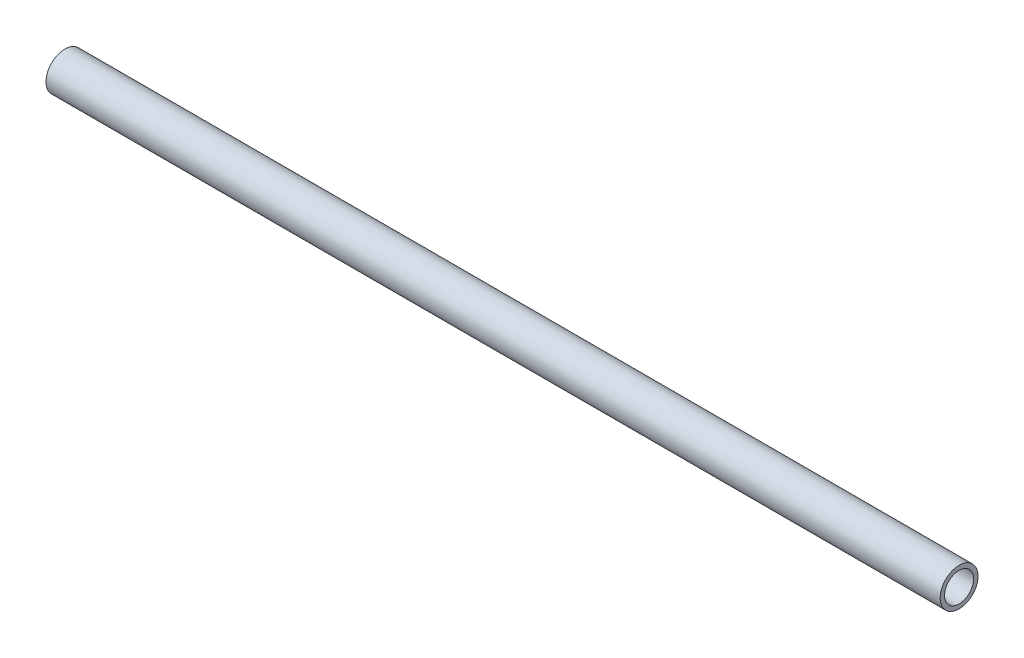
ISO-10303-21;
HEADER;
FILE_DESCRIPTION(('STEP AP214'),'2;1');
FILE_NAME('part.step','',(''),(''),'','','');
FILE_SCHEMA(('AUTOMOTIVE_DESIGN { 1 0 10303 214 1 1 1 1 }'));
ENDSEC;
DATA;
#1=APPLICATION_CONTEXT('core data for automotive mechanical design processes');
#2=APPLICATION_PROTOCOL_DEFINITION('international standard','automotive_design',2000,#1);
#3=PRODUCT_CONTEXT('',#1,'mechanical');
#4=PRODUCT('Part','Part','',(#3));
#5=PRODUCT_RELATED_PRODUCT_CATEGORY('part','',(#4));
#6=PRODUCT_DEFINITION_FORMATION('','',#4);
#7=PRODUCT_DEFINITION_CONTEXT('part definition',#1,'design');
#8=PRODUCT_DEFINITION('design','',#6,#7);
#9=PRODUCT_DEFINITION_SHAPE('','',#8);
#10=(LENGTH_UNIT() NAMED_UNIT(*) SI_UNIT(.MILLI.,.METRE.));
#11=(NAMED_UNIT(*) PLANE_ANGLE_UNIT() SI_UNIT($,.RADIAN.));
#12=(NAMED_UNIT(*) SI_UNIT($,.STERADIAN.) SOLID_ANGLE_UNIT());
#13=UNCERTAINTY_MEASURE_WITH_UNIT(LENGTH_MEASURE(1.E-05),#10,'distance_accuracy_value','');
#14=(GEOMETRIC_REPRESENTATION_CONTEXT(3) GLOBAL_UNCERTAINTY_ASSIGNED_CONTEXT((#13)) GLOBAL_UNIT_ASSIGNED_CONTEXT((#10,
#11,#12)) REPRESENTATION_CONTEXT('',''));
#15=CARTESIAN_POINT('',(0.,0.,0.));
#16=DIRECTION('',(0.,0.,1.));
#17=DIRECTION('',(1.,0.,0.));
#18=AXIS2_PLACEMENT_3D('',#15,#16,#17);
#19=CARTESIAN_POINT('',(167.866670015657,0.,0.));
#20=DIRECTION('',(-1.,0.,0.));
#21=DIRECTION('',(0.,0.,1.));
#22=AXIS2_PLACEMENT_3D('',#19,#20,#21);
#23=CYLINDRICAL_SURFACE('',#22,6.35);
#24=CARTESIAN_POINT('',(149.906157773519,0.,-1.13404158286892E-13));
#25=DIRECTION('',(1.,0.,0.));
#26=DIRECTION('',(0.,-0.0359450749230513,0.999353766985834));
#27=AXIS2_PLACEMENT_3D('',#24,#25,#26);
#28=CIRCLE('',#27,6.35);
#29=CARTESIAN_POINT('',(149.906157773519,0.,6.35));
#30=VERTEX_POINT('',#29);
#31=EDGE_CURVE('E10',#30,#30,#28,.T.);
#32=CARTESIAN_POINT('',(-149.906157773521,3.87779516291659E-13,-1.1088568542877E-13));
#33=DIRECTION('',(-1.,0.,0.));
#34=DIRECTION('',(0.,0.0359450749230514,-0.999353766985834));
#35=AXIS2_PLACEMENT_3D('',#32,#33,#34);
#36=CIRCLE('',#35,6.35);
#37=CARTESIAN_POINT('',(-149.906157773521,0.,6.35));
#38=VERTEX_POINT('',#37);
#39=EDGE_CURVE('E41',#38,#38,#36,.T.);
#40=CARTESIAN_POINT('',(149.906157773519,0.,6.35));
#41=CARTESIAN_POINT('',(146.783112819904,0.,6.35));
#42=CARTESIAN_POINT('',(143.660067866289,0.,6.35));
#43=CARTESIAN_POINT('',(137.413977959059,0.,6.35));
#44=CARTESIAN_POINT('',(134.290933005444,0.,6.35));
#45=CARTESIAN_POINT('',(128.044843098214,0.,6.35));
#46=CARTESIAN_POINT('',(124.921798144599,0.,6.35));
#47=CARTESIAN_POINT('',(118.675708237369,0.,6.35));
#48=CARTESIAN_POINT('',(115.552663283754,0.,6.35));
#49=CARTESIAN_POINT('',(109.306573376524,0.,6.35));
#50=CARTESIAN_POINT('',(106.183528422909,0.,6.35));
#51=CARTESIAN_POINT('',(99.937438515679,0.,6.35));
#52=CARTESIAN_POINT('',(96.814393562064,0.,6.35));
#53=CARTESIAN_POINT('',(90.568303654834,0.,6.35));
#54=CARTESIAN_POINT('',(87.445258701219,0.,6.35));
#55=CARTESIAN_POINT('',(81.199168793989,0.,6.35));
#56=CARTESIAN_POINT('',(78.0761238403741,0.,6.35));
#57=CARTESIAN_POINT('',(71.8300339331441,0.,6.35));
#58=CARTESIAN_POINT('',(68.7069889795291,0.,6.35));
#59=CARTESIAN_POINT('',(62.4608990722991,0.,6.35));
#60=CARTESIAN_POINT('',(59.3378541186841,0.,6.35));
#61=CARTESIAN_POINT('',(53.0917642114541,0.,6.35));
#62=CARTESIAN_POINT('',(49.9687192578391,0.,6.35));
#63=CARTESIAN_POINT('',(43.7226293506091,0.,6.35));
#64=CARTESIAN_POINT('',(40.5995843969941,0.,6.35));
#65=CARTESIAN_POINT('',(34.3534944897641,0.,6.35));
#66=CARTESIAN_POINT('',(31.2304495361491,0.,6.35));
#67=CARTESIAN_POINT('',(24.9843596289191,0.,6.35));
#68=CARTESIAN_POINT('',(21.8613146753041,0.,6.35));
#69=CARTESIAN_POINT('',(15.6152247680741,0.,6.35));
#70=CARTESIAN_POINT('',(12.4921798144592,0.,6.35));
#71=CARTESIAN_POINT('',(6.24608990722917,0.,6.35));
#72=CARTESIAN_POINT('',(3.12304495361417,0.,6.35));
#73=CARTESIAN_POINT('',(-3.12304495361582,0.,6.35));
#74=CARTESIAN_POINT('',(-6.2460899072308,0.,6.35));
#75=CARTESIAN_POINT('',(-12.4921798144608,0.,6.35));
#76=CARTESIAN_POINT('',(-15.6152247680758,0.,6.35));
#77=CARTESIAN_POINT('',(-21.8613146753058,0.,6.35));
#78=CARTESIAN_POINT('',(-24.9843596289208,0.,6.35));
#79=CARTESIAN_POINT('',(-31.2304495361508,0.,6.35));
#80=CARTESIAN_POINT('',(-34.3534944897658,0.,6.35));
#81=CARTESIAN_POINT('',(-40.5995843969958,0.,6.35));
#82=CARTESIAN_POINT('',(-43.7226293506108,0.,6.35));
#83=CARTESIAN_POINT('',(-49.9687192578407,0.,6.35));
#84=CARTESIAN_POINT('',(-53.0917642114557,0.,6.35));
#85=CARTESIAN_POINT('',(-59.3378541186857,0.,6.35));
#86=CARTESIAN_POINT('',(-62.4608990723007,0.,6.35));
#87=CARTESIAN_POINT('',(-68.7069889795307,0.,6.35));
#88=CARTESIAN_POINT('',(-71.8300339331457,0.,6.35));
#89=CARTESIAN_POINT('',(-78.0761238403757,0.,6.35));
#90=CARTESIAN_POINT('',(-81.1991687939907,0.,6.35));
#91=CARTESIAN_POINT('',(-87.4452587012207,0.,6.35));
#92=CARTESIAN_POINT('',(-90.5683036548356,0.,6.35));
#93=CARTESIAN_POINT('',(-96.8143935620656,0.,6.35));
#94=CARTESIAN_POINT('',(-99.9374385156806,0.,6.35));
#95=CARTESIAN_POINT('',(-106.183528422911,0.,6.35));
#96=CARTESIAN_POINT('',(-109.306573376526,0.,6.35));
#97=CARTESIAN_POINT('',(-115.552663283756,0.,6.35));
#98=CARTESIAN_POINT('',(-118.675708237371,0.,6.35));
#99=CARTESIAN_POINT('',(-124.921798144601,0.,6.35));
#100=CARTESIAN_POINT('',(-128.044843098216,0.,6.35));
#101=CARTESIAN_POINT('',(-134.290933005446,0.,6.35));
#102=CARTESIAN_POINT('',(-137.413977959061,0.,6.35));
#103=CARTESIAN_POINT('',(-143.660067866291,0.,6.35));
#104=CARTESIAN_POINT('',(-146.783112819906,0.,6.35));
#105=CARTESIAN_POINT('',(-149.906157773521,0.,6.35));
#106=B_SPLINE_CURVE_WITH_KNOTS('',3,(#40,#41,#42,#43,#44,#45,#46,#47,#48,#49,#50,#51,#52,#53,
#54,#55,#56,#57,#58,#59,#60,#61,#62,#63,#64,#65,#66,#67,#68,#69,#70,#71,#72,#73,#74,#75,#76,#77,
#78,#79,#80,#81,#82,#83,#84,#85,#86,#87,#88,#89,#90,#91,#92,#93,#94,#95,#96,#97,#98,#99,#100,
#101,#102,#103,#104,#105),.UNSPECIFIED.,.F.,.F.,(4,2,2,2,2,2,2,2,2,2,2,2,2,2,2,2,2,2,2,2,2,2,2,
2,2,2,2,2,2,2,2,2,4),(0.,9.36913486084498,18.73826972169,28.1074045825349,37.4765394433799,
46.8456743042249,56.2148091650699,65.5839440259149,74.9530788867599,84.3222137476048,
93.6913486084498,103.060483469295,112.42961833014,121.798753190985,131.16788805183,
140.537022912675,149.90615777352,159.275292634365,168.64442749521,178.013562356055,
187.3826972169,196.751832077745,206.12096693859,215.490101799435,224.85923666028,
234.228371521125,243.59750638197,252.966641242815,262.33577610366,271.704910964505,
281.07404582535,290.443180686194,299.812315547039),.UNSPECIFIED.);
#107=EDGE_CURVE('BSEAM31',#30,#38,#106,.T.);
#108=ORIENTED_EDGE('',*,*,#31,.F.);
#109=ORIENTED_EDGE('',*,*,#39,.F.);
#110=ORIENTED_EDGE('',*,*,#107,.T.);
#111=ORIENTED_EDGE('',*,*,#107,.F.);
#112=EDGE_LOOP('',(#108,#110,#109,#111));
#113=FACE_BOUND('',#112,.T.);
#114=ADVANCED_FACE('F31',(#113),#23,.T.);
#115=CARTESIAN_POINT('',(167.866670015657,0.,0.));
#116=DIRECTION('',(-1.,0.,0.));
#117=DIRECTION('',(0.,0.,1.));
#118=AXIS2_PLACEMENT_3D('',#115,#116,#117);
#119=CYLINDRICAL_SURFACE('',#118,4.8768);
#120=CARTESIAN_POINT('',(149.906157773519,0.,-1.13404158286892E-13));
#121=DIRECTION('',(1.,0.,0.));
#122=DIRECTION('',(0.,-0.0359450749230513,0.999353766985834));
#123=AXIS2_PLACEMENT_3D('',#120,#121,#122);
#124=CIRCLE('',#123,4.8768);
#125=CARTESIAN_POINT('',(149.906157773519,0.,4.8768));
#126=VERTEX_POINT('',#125);
#127=EDGE_CURVE('E37',#126,#126,#124,.T.);
#128=CARTESIAN_POINT('',(-149.906157773521,3.87779516291659E-13,-1.1088568542877E-13));
#129=DIRECTION('',(-1.,0.,0.));
#130=DIRECTION('',(0.,0.0359450749230514,-0.999353766985834));
#131=AXIS2_PLACEMENT_3D('',#128,#129,#130);
#132=CIRCLE('',#131,4.8768);
#133=CARTESIAN_POINT('',(-149.906157773521,0.,4.8768));
#134=VERTEX_POINT('',#133);
#135=EDGE_CURVE('E45',#134,#134,#132,.T.);
#136=CARTESIAN_POINT('',(149.906157773519,0.,4.8768));
#137=CARTESIAN_POINT('',(146.783112819904,0.,4.8768));
#138=CARTESIAN_POINT('',(143.660067866289,0.,4.8768));
#139=CARTESIAN_POINT('',(137.413977959059,0.,4.8768));
#140=CARTESIAN_POINT('',(134.290933005444,0.,4.8768));
#141=CARTESIAN_POINT('',(128.044843098214,0.,4.8768));
#142=CARTESIAN_POINT('',(124.921798144599,0.,4.8768));
#143=CARTESIAN_POINT('',(118.675708237369,0.,4.8768));
#144=CARTESIAN_POINT('',(115.552663283754,0.,4.8768));
#145=CARTESIAN_POINT('',(109.306573376524,0.,4.8768));
#146=CARTESIAN_POINT('',(106.183528422909,0.,4.8768));
#147=CARTESIAN_POINT('',(99.937438515679,0.,4.8768));
#148=CARTESIAN_POINT('',(96.814393562064,0.,4.8768));
#149=CARTESIAN_POINT('',(90.568303654834,0.,4.8768));
#150=CARTESIAN_POINT('',(87.445258701219,0.,4.8768));
#151=CARTESIAN_POINT('',(81.199168793989,0.,4.8768));
#152=CARTESIAN_POINT('',(78.0761238403741,0.,4.8768));
#153=CARTESIAN_POINT('',(71.8300339331441,0.,4.8768));
#154=CARTESIAN_POINT('',(68.7069889795291,0.,4.8768));
#155=CARTESIAN_POINT('',(62.4608990722991,0.,4.8768));
#156=CARTESIAN_POINT('',(59.3378541186841,0.,4.8768));
#157=CARTESIAN_POINT('',(53.0917642114541,0.,4.8768));
#158=CARTESIAN_POINT('',(49.9687192578391,0.,4.8768));
#159=CARTESIAN_POINT('',(43.7226293506091,0.,4.8768));
#160=CARTESIAN_POINT('',(40.5995843969941,0.,4.8768));
#161=CARTESIAN_POINT('',(34.3534944897641,0.,4.8768));
#162=CARTESIAN_POINT('',(31.2304495361491,0.,4.8768));
#163=CARTESIAN_POINT('',(24.9843596289191,0.,4.8768));
#164=CARTESIAN_POINT('',(21.8613146753041,0.,4.8768));
#165=CARTESIAN_POINT('',(15.6152247680741,0.,4.8768));
#166=CARTESIAN_POINT('',(12.4921798144592,0.,4.8768));
#167=CARTESIAN_POINT('',(6.24608990722917,0.,4.8768));
#168=CARTESIAN_POINT('',(3.12304495361417,0.,4.8768));
#169=CARTESIAN_POINT('',(-3.12304495361582,0.,4.8768));
#170=CARTESIAN_POINT('',(-6.2460899072308,0.,4.8768));
#171=CARTESIAN_POINT('',(-12.4921798144608,0.,4.8768));
#172=CARTESIAN_POINT('',(-15.6152247680758,0.,4.8768));
#173=CARTESIAN_POINT('',(-21.8613146753058,0.,4.8768));
#174=CARTESIAN_POINT('',(-24.9843596289208,0.,4.8768));
#175=CARTESIAN_POINT('',(-31.2304495361508,0.,4.8768));
#176=CARTESIAN_POINT('',(-34.3534944897658,0.,4.8768));
#177=CARTESIAN_POINT('',(-40.5995843969958,0.,4.8768));
#178=CARTESIAN_POINT('',(-43.7226293506108,0.,4.8768));
#179=CARTESIAN_POINT('',(-49.9687192578407,0.,4.8768));
#180=CARTESIAN_POINT('',(-53.0917642114557,0.,4.8768));
#181=CARTESIAN_POINT('',(-59.3378541186857,0.,4.8768));
#182=CARTESIAN_POINT('',(-62.4608990723007,0.,4.8768));
#183=CARTESIAN_POINT('',(-68.7069889795307,0.,4.8768));
#184=CARTESIAN_POINT('',(-71.8300339331457,0.,4.8768));
#185=CARTESIAN_POINT('',(-78.0761238403757,0.,4.8768));
#186=CARTESIAN_POINT('',(-81.1991687939907,0.,4.8768));
#187=CARTESIAN_POINT('',(-87.4452587012207,0.,4.8768));
#188=CARTESIAN_POINT('',(-90.5683036548356,0.,4.8768));
#189=CARTESIAN_POINT('',(-96.8143935620656,0.,4.8768));
#190=CARTESIAN_POINT('',(-99.9374385156806,0.,4.8768));
#191=CARTESIAN_POINT('',(-106.183528422911,0.,4.8768));
#192=CARTESIAN_POINT('',(-109.306573376526,0.,4.8768));
#193=CARTESIAN_POINT('',(-115.552663283756,0.,4.8768));
#194=CARTESIAN_POINT('',(-118.675708237371,0.,4.8768));
#195=CARTESIAN_POINT('',(-124.921798144601,0.,4.8768));
#196=CARTESIAN_POINT('',(-128.044843098216,0.,4.8768));
#197=CARTESIAN_POINT('',(-134.290933005446,0.,4.8768));
#198=CARTESIAN_POINT('',(-137.413977959061,0.,4.8768));
#199=CARTESIAN_POINT('',(-143.660067866291,0.,4.8768));
#200=CARTESIAN_POINT('',(-146.783112819906,0.,4.8768));
#201=CARTESIAN_POINT('',(-149.906157773521,0.,4.8768));
#202=B_SPLINE_CURVE_WITH_KNOTS('',3,(#136,#137,#138,#139,#140,#141,#142,#143,#144,#145,#146,
#147,#148,#149,#150,#151,#152,#153,#154,#155,#156,#157,#158,#159,#160,#161,#162,#163,#164,#165,
#166,#167,#168,#169,#170,#171,#172,#173,#174,#175,#176,#177,#178,#179,#180,#181,#182,#183,#184,
#185,#186,#187,#188,#189,#190,#191,#192,#193,#194,#195,#196,#197,#198,#199,#200,#201),
.UNSPECIFIED.,.F.,.F.,(4,2,2,2,2,2,2,2,2,2,2,2,2,2,2,2,2,2,2,2,2,2,2,2,2,2,2,2,2,2,2,2,4),(0.,
9.36913486084498,18.73826972169,28.1074045825349,37.4765394433799,46.8456743042249,
56.2148091650699,65.5839440259149,74.9530788867599,84.3222137476048,93.6913486084498,
103.060483469295,112.42961833014,121.798753190985,131.16788805183,140.537022912675,
149.90615777352,159.275292634365,168.64442749521,178.013562356055,187.3826972169,
196.751832077745,206.12096693859,215.490101799435,224.85923666028,234.228371521125,
243.59750638197,252.966641242815,262.33577610366,271.704910964505,281.07404582535,
290.443180686194,299.812315547039),.UNSPECIFIED.);
#203=EDGE_CURVE('BSEAM51',#126,#134,#202,.T.);
#204=ORIENTED_EDGE('',*,*,#127,.T.);
#205=ORIENTED_EDGE('',*,*,#135,.T.);
#206=ORIENTED_EDGE('',*,*,#203,.T.);
#207=ORIENTED_EDGE('',*,*,#203,.F.);
#208=EDGE_LOOP('',(#204,#206,#205,#207));
#209=FACE_BOUND('',#208,.T.);
#210=ADVANCED_FACE('F51',(#209),#119,.F.);
#211=CARTESIAN_POINT('',(149.906157773519,0.,-1.13404158286892E-13));
#212=DIRECTION('',(-1.,0.,0.));
#213=DIRECTION('',(0.,-0.0359450749230513,0.999353766985834));
#214=AXIS2_PLACEMENT_3D('',#211,#212,#213);
#215=PLANE('',#214);
#216=ORIENTED_EDGE('',*,*,#127,.F.);
#217=EDGE_LOOP('',(#216));
#218=FACE_BOUND('',#217,.T.);
#219=ORIENTED_EDGE('',*,*,#31,.T.);
#220=EDGE_LOOP('',(#219));
#221=FACE_BOUND('',#220,.T.);
#222=ADVANCED_FACE('F56',(#218,#221),#215,.F.);
#223=CARTESIAN_POINT('',(-149.906157773521,3.87779516291659E-13,-1.1088568542877E-13));
#224=DIRECTION('',(1.,0.,0.));
#225=DIRECTION('',(0.,0.0359450749230514,-0.999353766985834));
#226=AXIS2_PLACEMENT_3D('',#223,#224,#225);
#227=PLANE('',#226);
#228=ORIENTED_EDGE('',*,*,#135,.F.);
#229=EDGE_LOOP('',(#228));
#230=FACE_BOUND('',#229,.T.);
#231=ORIENTED_EDGE('',*,*,#39,.T.);
#232=EDGE_LOOP('',(#231));
#233=FACE_BOUND('',#232,.T.);
#234=ADVANCED_FACE('F53',(#230,#233),#227,.F.);
#235=CLOSED_SHELL('',(#114,#210,#222,#234));
#236=MANIFOLD_SOLID_BREP('B2',#235);
#237=ADVANCED_BREP_SHAPE_REPRESENTATION('',(#18,#236),#14);
#238=SHAPE_DEFINITION_REPRESENTATION(#9,#237);
ENDSEC;
END-ISO-10303-21;
